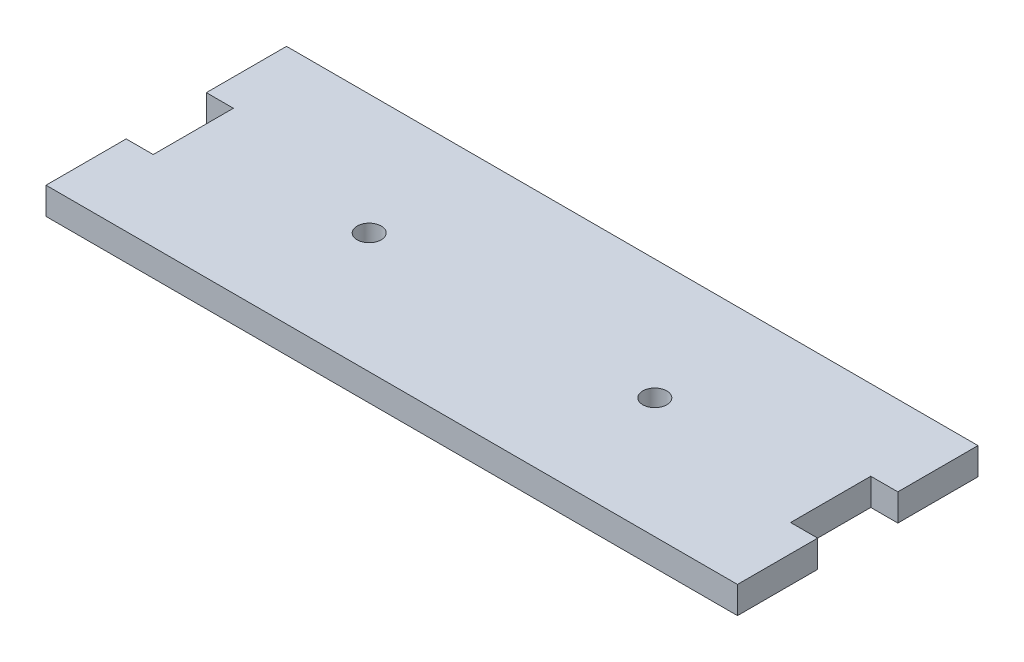
ISO-10303-21;
HEADER;
FILE_DESCRIPTION(('STEP AP214'),'2;1');
FILE_NAME('part.step','',(''),(''),'','','');
FILE_SCHEMA(('AUTOMOTIVE_DESIGN { 1 0 10303 214 1 1 1 1 }'));
ENDSEC;
DATA;
#1=APPLICATION_CONTEXT('core data for automotive mechanical design processes');
#2=APPLICATION_PROTOCOL_DEFINITION('international standard','automotive_design',2000,#1);
#3=PRODUCT_CONTEXT('',#1,'mechanical');
#4=PRODUCT('Part','Part','',(#3));
#5=PRODUCT_RELATED_PRODUCT_CATEGORY('part','',(#4));
#6=PRODUCT_DEFINITION_FORMATION('','',#4);
#7=PRODUCT_DEFINITION_CONTEXT('part definition',#1,'design');
#8=PRODUCT_DEFINITION('design','',#6,#7);
#9=PRODUCT_DEFINITION_SHAPE('','',#8);
#10=(LENGTH_UNIT() NAMED_UNIT(*) SI_UNIT(.MILLI.,.METRE.));
#11=(NAMED_UNIT(*) PLANE_ANGLE_UNIT() SI_UNIT($,.RADIAN.));
#12=(NAMED_UNIT(*) SI_UNIT($,.STERADIAN.) SOLID_ANGLE_UNIT());
#13=UNCERTAINTY_MEASURE_WITH_UNIT(LENGTH_MEASURE(1.E-05),#10,'distance_accuracy_value','');
#14=(GEOMETRIC_REPRESENTATION_CONTEXT(3) GLOBAL_UNCERTAINTY_ASSIGNED_CONTEXT((#13)) GLOBAL_UNIT_ASSIGNED_CONTEXT((#10,
#11,#12)) REPRESENTATION_CONTEXT('',''));
#15=CARTESIAN_POINT('',(0.,0.,0.));
#16=DIRECTION('',(0.,0.,1.));
#17=DIRECTION('',(1.,0.,0.));
#18=AXIS2_PLACEMENT_3D('',#15,#16,#17);
#19=CARTESIAN_POINT('',(221.,9.,0.));
#20=DIRECTION('',(1.,0.,0.));
#21=DIRECTION('',(0.,0.,-1.));
#22=AXIS2_PLACEMENT_3D('',#19,#20,#21);
#23=PLANE('',#22);
#24=DIRECTION('',(0.,0.,1.));
#25=VECTOR('',#24,1.);
#26=CARTESIAN_POINT('',(221.,0.,0.));
#27=LINE('',#26,#25);
#28=CARTESIAN_POINT('',(221.,0.,-53.3333333333334));
#29=VERTEX_POINT('',#28);
#30=CARTESIAN_POINT('',(221.,0.,-26.6666666666666));
#31=VERTEX_POINT('',#30);
#32=EDGE_CURVE('E163',#29,#31,#27,.T.);
#33=ORIENTED_EDGE('',*,*,#32,.F.);
#34=DIRECTION('',(0.,-1.,0.));
#35=VECTOR('',#34,1.);
#36=CARTESIAN_POINT('',(221.,9.,-53.3333333333334));
#37=LINE('',#36,#35);
#38=CARTESIAN_POINT('',(221.,9.,-53.3333333333334));
#39=VERTEX_POINT('',#38);
#40=EDGE_CURVE('E11',#39,#29,#37,.T.);
#41=ORIENTED_EDGE('',*,*,#40,.F.);
#42=DIRECTION('',(0.,0.,1.));
#43=VECTOR('',#42,1.);
#44=CARTESIAN_POINT('',(221.,9.,0.));
#45=LINE('',#44,#43);
#46=CARTESIAN_POINT('',(221.,9.,-26.6666666666666));
#47=VERTEX_POINT('',#46);
#48=EDGE_CURVE('E199',#39,#47,#45,.T.);
#49=ORIENTED_EDGE('',*,*,#48,.T.);
#50=DIRECTION('',(0.,-1.,0.));
#51=VECTOR('',#50,1.);
#52=CARTESIAN_POINT('',(221.,9.,-26.6666666666666));
#53=LINE('',#52,#51);
#54=EDGE_CURVE('E103',#47,#31,#53,.T.);
#55=ORIENTED_EDGE('',*,*,#54,.T.);
#56=EDGE_LOOP('',(#33,#41,#49,#55));
#57=FACE_BOUND('',#56,.T.);
#58=ADVANCED_FACE('F40',(#57),#23,.T.);
#59=CARTESIAN_POINT('',(3.28954970259314E-13,9.,-53.3333333333347));
#60=DIRECTION('',(0.,0.,1.));
#61=DIRECTION('',(1.,0.,0.));
#62=AXIS2_PLACEMENT_3D('',#59,#60,#61);
#63=PLANE('',#62);
#64=DIRECTION('',(-1.,0.,0.));
#65=VECTOR('',#64,1.);
#66=CARTESIAN_POINT('',(3.28954970259314E-13,0.,-53.3333333333347));
#67=LINE('',#66,#65);
#68=CARTESIAN_POINT('',(230.,0.,-53.3333333333333));
#69=VERTEX_POINT('',#68);
#70=EDGE_CURVE('E166',#69,#29,#67,.T.);
#71=ORIENTED_EDGE('',*,*,#70,.F.);
#72=DIRECTION('',(0.,-1.,0.));
#73=VECTOR('',#72,1.);
#74=CARTESIAN_POINT('',(230.,9.,-53.3333333333333));
#75=LINE('',#74,#73);
#76=CARTESIAN_POINT('',(230.,9.,-53.3333333333333));
#77=VERTEX_POINT('',#76);
#78=EDGE_CURVE('E48',#77,#69,#75,.T.);
#79=ORIENTED_EDGE('',*,*,#78,.F.);
#80=DIRECTION('',(-1.,0.,0.));
#81=VECTOR('',#80,1.);
#82=CARTESIAN_POINT('',(3.28954970259314E-13,9.,-53.3333333333347));
#83=LINE('',#82,#81);
#84=EDGE_CURVE('E230',#77,#39,#83,.T.);
#85=ORIENTED_EDGE('',*,*,#84,.T.);
#86=ORIENTED_EDGE('',*,*,#40,.T.);
#87=EDGE_LOOP('',(#71,#79,#85,#86));
#88=FACE_BOUND('',#87,.T.);
#89=ADVANCED_FACE('F229',(#88),#63,.T.);
#90=CARTESIAN_POINT('',(230.,9.,0.));
#91=DIRECTION('',(-1.,0.,0.));
#92=DIRECTION('',(0.,0.,1.));
#93=AXIS2_PLACEMENT_3D('',#90,#91,#92);
#94=PLANE('',#93);
#95=DIRECTION('',(0.,0.,-1.));
#96=VECTOR('',#95,1.);
#97=CARTESIAN_POINT('',(230.,0.,0.));
#98=LINE('',#97,#96);
#99=CARTESIAN_POINT('',(230.,0.,-80.));
#100=VERTEX_POINT('',#99);
#101=EDGE_CURVE('E169',#69,#100,#98,.T.);
#102=ORIENTED_EDGE('',*,*,#101,.T.);
#103=DIRECTION('',(0.,-1.,0.));
#104=VECTOR('',#103,1.);
#105=CARTESIAN_POINT('',(230.,9.,-80.));
#106=LINE('',#105,#104);
#107=CARTESIAN_POINT('',(230.,9.,-80.));
#108=VERTEX_POINT('',#107);
#109=EDGE_CURVE('E214',#108,#100,#106,.T.);
#110=ORIENTED_EDGE('',*,*,#109,.F.);
#111=DIRECTION('',(0.,0.,-1.));
#112=VECTOR('',#111,1.);
#113=CARTESIAN_POINT('',(230.,9.,0.));
#114=LINE('',#113,#112);
#115=EDGE_CURVE('E220',#77,#108,#114,.T.);
#116=ORIENTED_EDGE('',*,*,#115,.F.);
#117=ORIENTED_EDGE('',*,*,#78,.T.);
#118=EDGE_LOOP('',(#102,#110,#116,#117));
#119=FACE_BOUND('',#118,.T.);
#120=ADVANCED_FACE('F218',(#119),#94,.F.);
#121=CARTESIAN_POINT('',(0.,9.,-80.));
#122=DIRECTION('',(0.,0.,-1.));
#123=DIRECTION('',(-1.,0.,0.));
#124=AXIS2_PLACEMENT_3D('',#121,#122,#123);
#125=PLANE('',#124);
#126=DIRECTION('',(1.,0.,0.));
#127=VECTOR('',#126,1.);
#128=CARTESIAN_POINT('',(0.,0.,-80.));
#129=LINE('',#128,#127);
#130=CARTESIAN_POINT('',(0.,0.,-80.));
#131=VERTEX_POINT('',#130);
#132=EDGE_CURVE('E172',#131,#100,#129,.T.);
#133=ORIENTED_EDGE('',*,*,#132,.F.);
#134=DIRECTION('',(0.,-1.,0.));
#135=VECTOR('',#134,1.);
#136=CARTESIAN_POINT('',(0.,9.,-80.));
#137=LINE('',#136,#135);
#138=CARTESIAN_POINT('',(0.,9.,-80.));
#139=VERTEX_POINT('',#138);
#140=EDGE_CURVE('E212',#139,#131,#137,.T.);
#141=ORIENTED_EDGE('',*,*,#140,.F.);
#142=DIRECTION('',(1.,0.,0.));
#143=VECTOR('',#142,1.);
#144=CARTESIAN_POINT('',(0.,9.,-80.));
#145=LINE('',#144,#143);
#146=EDGE_CURVE('E238',#139,#108,#145,.T.);
#147=ORIENTED_EDGE('',*,*,#146,.T.);
#148=ORIENTED_EDGE('',*,*,#109,.T.);
#149=EDGE_LOOP('',(#133,#141,#147,#148));
#150=FACE_BOUND('',#149,.T.);
#151=ADVANCED_FACE('F272',(#150),#125,.T.);
#152=CARTESIAN_POINT('',(0.,9.,0.));
#153=DIRECTION('',(-1.,0.,0.));
#154=DIRECTION('',(0.,0.,1.));
#155=AXIS2_PLACEMENT_3D('',#152,#153,#154);
#156=PLANE('',#155);
#157=DIRECTION('',(0.,0.,-1.));
#158=VECTOR('',#157,1.);
#159=CARTESIAN_POINT('',(0.,0.,0.));
#160=LINE('',#159,#158);
#161=CARTESIAN_POINT('',(0.,0.,-53.3333333333333));
#162=VERTEX_POINT('',#161);
#163=EDGE_CURVE('E175',#162,#131,#160,.T.);
#164=ORIENTED_EDGE('',*,*,#163,.F.);
#165=DIRECTION('',(0.,-1.,0.));
#166=VECTOR('',#165,1.);
#167=CARTESIAN_POINT('',(0.,9.,-53.3333333333333));
#168=LINE('',#167,#166);
#169=CARTESIAN_POINT('',(0.,9.,-53.3333333333333));
#170=VERTEX_POINT('',#169);
#171=EDGE_CURVE('E210',#170,#162,#168,.T.);
#172=ORIENTED_EDGE('',*,*,#171,.F.);
#173=DIRECTION('',(0.,0.,-1.));
#174=VECTOR('',#173,1.);
#175=CARTESIAN_POINT('',(0.,9.,0.));
#176=LINE('',#175,#174);
#177=EDGE_CURVE('E241',#170,#139,#176,.T.);
#178=ORIENTED_EDGE('',*,*,#177,.T.);
#179=ORIENTED_EDGE('',*,*,#140,.T.);
#180=EDGE_LOOP('',(#164,#172,#178,#179));
#181=FACE_BOUND('',#180,.T.);
#182=ADVANCED_FACE('F269',(#181),#156,.T.);
#183=CARTESIAN_POINT('',(0.,9.,-53.3333333333333));
#184=DIRECTION('',(0.,0.,-1.));
#185=DIRECTION('',(-1.,0.,0.));
#186=AXIS2_PLACEMENT_3D('',#183,#184,#185);
#187=PLANE('',#186);
#188=DIRECTION('',(1.,0.,0.));
#189=VECTOR('',#188,1.);
#190=CARTESIAN_POINT('',(0.,0.,-53.3333333333333));
#191=LINE('',#190,#189);
#192=CARTESIAN_POINT('',(9.00000000000001,0.,-53.3333333333333));
#193=VERTEX_POINT('',#192);
#194=EDGE_CURVE('E178',#162,#193,#191,.T.);
#195=ORIENTED_EDGE('',*,*,#194,.T.);
#196=DIRECTION('',(0.,-1.,0.));
#197=VECTOR('',#196,1.);
#198=CARTESIAN_POINT('',(9.00000000000001,9.,-53.3333333333333));
#199=LINE('',#198,#197);
#200=CARTESIAN_POINT('',(9.00000000000001,9.,-53.3333333333333));
#201=VERTEX_POINT('',#200);
#202=EDGE_CURVE('E207',#201,#193,#199,.T.);
#203=ORIENTED_EDGE('',*,*,#202,.F.);
#204=DIRECTION('',(1.,0.,0.));
#205=VECTOR('',#204,1.);
#206=CARTESIAN_POINT('',(0.,9.,-53.3333333333333));
#207=LINE('',#206,#205);
#208=EDGE_CURVE('E244',#170,#201,#207,.T.);
#209=ORIENTED_EDGE('',*,*,#208,.F.);
#210=ORIENTED_EDGE('',*,*,#171,.T.);
#211=EDGE_LOOP('',(#195,#203,#209,#210));
#212=FACE_BOUND('',#211,.T.);
#213=ADVANCED_FACE('F265',(#212),#187,.F.);
#214=CARTESIAN_POINT('',(9.00000000000001,9.,0.));
#215=DIRECTION('',(1.,0.,0.));
#216=DIRECTION('',(0.,0.,-1.));
#217=AXIS2_PLACEMENT_3D('',#214,#215,#216);
#218=PLANE('',#217);
#219=DIRECTION('',(0.,0.,1.));
#220=VECTOR('',#219,1.);
#221=CARTESIAN_POINT('',(9.00000000000001,0.,0.));
#222=LINE('',#221,#220);
#223=CARTESIAN_POINT('',(9.00000000000001,0.,-26.6666666666667));
#224=VERTEX_POINT('',#223);
#225=EDGE_CURVE('E180',#193,#224,#222,.T.);
#226=ORIENTED_EDGE('',*,*,#225,.T.);
#227=DIRECTION('',(0.,-1.,0.));
#228=VECTOR('',#227,1.);
#229=CARTESIAN_POINT('',(9.00000000000001,9.,-26.6666666666667));
#230=LINE('',#229,#228);
#231=CARTESIAN_POINT('',(9.00000000000001,9.,-26.6666666666667));
#232=VERTEX_POINT('',#231);
#233=EDGE_CURVE('E205',#232,#224,#230,.T.);
#234=ORIENTED_EDGE('',*,*,#233,.F.);
#235=DIRECTION('',(0.,0.,1.));
#236=VECTOR('',#235,1.);
#237=CARTESIAN_POINT('',(9.00000000000001,9.,0.));
#238=LINE('',#237,#236);
#239=EDGE_CURVE('E246',#201,#232,#238,.T.);
#240=ORIENTED_EDGE('',*,*,#239,.F.);
#241=ORIENTED_EDGE('',*,*,#202,.T.);
#242=EDGE_LOOP('',(#226,#234,#240,#241));
#243=FACE_BOUND('',#242,.T.);
#244=ADVANCED_FACE('F261',(#243),#218,.F.);
#245=CARTESIAN_POINT('',(0.,9.,-26.6666666666667));
#246=DIRECTION('',(0.,0.,-1.));
#247=DIRECTION('',(-1.,0.,0.));
#248=AXIS2_PLACEMENT_3D('',#245,#246,#247);
#249=PLANE('',#248);
#250=DIRECTION('',(1.,0.,0.));
#251=VECTOR('',#250,1.);
#252=CARTESIAN_POINT('',(0.,0.,-26.6666666666667));
#253=LINE('',#252,#251);
#254=CARTESIAN_POINT('',(0.,0.,-26.6666666666667));
#255=VERTEX_POINT('',#254);
#256=EDGE_CURVE('E183',#255,#224,#253,.T.);
#257=ORIENTED_EDGE('',*,*,#256,.F.);
#258=DIRECTION('',(0.,-1.,0.));
#259=VECTOR('',#258,1.);
#260=CARTESIAN_POINT('',(0.,9.,-26.6666666666667));
#261=LINE('',#260,#259);
#262=CARTESIAN_POINT('',(0.,9.,-26.6666666666667));
#263=VERTEX_POINT('',#262);
#264=EDGE_CURVE('E203',#263,#255,#261,.T.);
#265=ORIENTED_EDGE('',*,*,#264,.F.);
#266=DIRECTION('',(1.,0.,0.));
#267=VECTOR('',#266,1.);
#268=CARTESIAN_POINT('',(0.,9.,-26.6666666666667));
#269=LINE('',#268,#267);
#270=EDGE_CURVE('E248',#263,#232,#269,.T.);
#271=ORIENTED_EDGE('',*,*,#270,.T.);
#272=ORIENTED_EDGE('',*,*,#233,.T.);
#273=EDGE_LOOP('',(#257,#265,#271,#272));
#274=FACE_BOUND('',#273,.T.);
#275=ADVANCED_FACE('F257',(#274),#249,.T.);
#276=CARTESIAN_POINT('',(0.,9.,0.));
#277=DIRECTION('',(-1.,0.,0.));
#278=DIRECTION('',(0.,0.,1.));
#279=AXIS2_PLACEMENT_3D('',#276,#277,#278);
#280=PLANE('',#279);
#281=DIRECTION('',(0.,0.,-1.));
#282=VECTOR('',#281,1.);
#283=CARTESIAN_POINT('',(0.,0.,0.));
#284=LINE('',#283,#282);
#285=CARTESIAN_POINT('',(0.,0.,0.));
#286=VERTEX_POINT('',#285);
#287=EDGE_CURVE('E186',#286,#255,#284,.T.);
#288=ORIENTED_EDGE('',*,*,#287,.F.);
#289=DIRECTION('',(0.,-1.,0.));
#290=VECTOR('',#289,1.);
#291=CARTESIAN_POINT('',(0.,9.,0.));
#292=LINE('',#291,#290);
#293=CARTESIAN_POINT('',(0.,9.,0.));
#294=VERTEX_POINT('',#293);
#295=EDGE_CURVE('E149',#294,#286,#292,.T.);
#296=ORIENTED_EDGE('',*,*,#295,.F.);
#297=DIRECTION('',(0.,0.,-1.));
#298=VECTOR('',#297,1.);
#299=CARTESIAN_POINT('',(0.,9.,0.));
#300=LINE('',#299,#298);
#301=EDGE_CURVE('E142',#294,#263,#300,.T.);
#302=ORIENTED_EDGE('',*,*,#301,.T.);
#303=ORIENTED_EDGE('',*,*,#264,.T.);
#304=EDGE_LOOP('',(#288,#296,#302,#303));
#305=FACE_BOUND('',#304,.T.);
#306=ADVANCED_FACE('F252',(#305),#280,.T.);
#307=CARTESIAN_POINT('',(0.,9.,0.));
#308=DIRECTION('',(0.,0.,-1.));
#309=DIRECTION('',(-1.,0.,0.));
#310=AXIS2_PLACEMENT_3D('',#307,#308,#309);
#311=PLANE('',#310);
#312=DIRECTION('',(1.,0.,0.));
#313=VECTOR('',#312,1.);
#314=CARTESIAN_POINT('',(0.,0.,0.));
#315=LINE('',#314,#313);
#316=CARTESIAN_POINT('',(230.,0.,0.));
#317=VERTEX_POINT('',#316);
#318=EDGE_CURVE('E148',#286,#317,#315,.T.);
#319=ORIENTED_EDGE('',*,*,#318,.T.);
#320=DIRECTION('',(0.,-1.,0.));
#321=VECTOR('',#320,1.);
#322=CARTESIAN_POINT('',(230.,9.,0.));
#323=LINE('',#322,#321);
#324=CARTESIAN_POINT('',(230.,9.,0.));
#325=VERTEX_POINT('',#324);
#326=EDGE_CURVE('E145',#325,#317,#323,.T.);
#327=ORIENTED_EDGE('',*,*,#326,.F.);
#328=DIRECTION('',(1.,0.,0.));
#329=VECTOR('',#328,1.);
#330=CARTESIAN_POINT('',(0.,9.,0.));
#331=LINE('',#330,#329);
#332=EDGE_CURVE('E134',#294,#325,#331,.T.);
#333=ORIENTED_EDGE('',*,*,#332,.F.);
#334=ORIENTED_EDGE('',*,*,#295,.T.);
#335=EDGE_LOOP('',(#319,#327,#333,#334));
#336=FACE_BOUND('',#335,.T.);
#337=ADVANCED_FACE('F146',(#336),#311,.F.);
#338=CARTESIAN_POINT('',(230.,9.,0.));
#339=DIRECTION('',(-1.,0.,0.));
#340=DIRECTION('',(0.,0.,1.));
#341=AXIS2_PLACEMENT_3D('',#338,#339,#340);
#342=PLANE('',#341);
#343=DIRECTION('',(0.,0.,-1.));
#344=VECTOR('',#343,1.);
#345=CARTESIAN_POINT('',(230.,0.,0.));
#346=LINE('',#345,#344);
#347=CARTESIAN_POINT('',(230.,0.,-26.6666666666667));
#348=VERTEX_POINT('',#347);
#349=EDGE_CURVE('E96',#317,#348,#346,.T.);
#350=ORIENTED_EDGE('',*,*,#349,.T.);
#351=DIRECTION('',(0.,-1.,0.));
#352=VECTOR('',#351,1.);
#353=CARTESIAN_POINT('',(230.,9.,-26.6666666666667));
#354=LINE('',#353,#352);
#355=CARTESIAN_POINT('',(230.,9.,-26.6666666666667));
#356=VERTEX_POINT('',#355);
#357=EDGE_CURVE('E150',#356,#348,#354,.T.);
#358=ORIENTED_EDGE('',*,*,#357,.F.);
#359=DIRECTION('',(0.,0.,-1.));
#360=VECTOR('',#359,1.);
#361=CARTESIAN_POINT('',(230.,9.,0.));
#362=LINE('',#361,#360);
#363=EDGE_CURVE('E139',#325,#356,#362,.T.);
#364=ORIENTED_EDGE('',*,*,#363,.F.);
#365=ORIENTED_EDGE('',*,*,#326,.T.);
#366=EDGE_LOOP('',(#350,#358,#364,#365));
#367=FACE_BOUND('',#366,.T.);
#368=ADVANCED_FACE('F152',(#367),#342,.F.);
#369=CARTESIAN_POINT('',(67.5,9.,-40.));
#370=DIRECTION('',(0.,-1.,0.));
#371=DIRECTION('',(0.,0.,-1.));
#372=AXIS2_PLACEMENT_3D('',#369,#370,#371);
#373=CYLINDRICAL_SURFACE('',#372,4.00000000000001);
#374=CARTESIAN_POINT('',(67.5,9.,-40.));
#375=DIRECTION('',(0.,1.,0.));
#376=DIRECTION('',(0.,0.,1.));
#377=AXIS2_PLACEMENT_3D('',#374,#375,#376);
#378=CIRCLE('',#377,4.00000000000001);
#379=CARTESIAN_POINT('',(67.5,9.,-36.));
#380=VERTEX_POINT('',#379);
#381=EDGE_CURVE('E154',#380,#380,#378,.T.);
#382=ORIENTED_EDGE('',*,*,#381,.T.);
#383=EDGE_LOOP('',(#382));
#384=FACE_BOUND('',#383,.T.);
#385=CARTESIAN_POINT('',(67.5,0.,-40.));
#386=DIRECTION('',(0.,1.,0.));
#387=DIRECTION('',(0.,0.,1.));
#388=AXIS2_PLACEMENT_3D('',#385,#386,#387);
#389=CIRCLE('',#388,4.00000000000001);
#390=CARTESIAN_POINT('',(67.5,0.,-36.));
#391=VERTEX_POINT('',#390);
#392=EDGE_CURVE('E193',#391,#391,#389,.T.);
#393=ORIENTED_EDGE('',*,*,#392,.F.);
#394=EDGE_LOOP('',(#393));
#395=FACE_BOUND('',#394,.T.);
#396=ADVANCED_FACE('F359',(#384,#395),#373,.F.);
#397=CARTESIAN_POINT('',(-1.64477485129644E-13,9.,-26.6666666666653));
#398=DIRECTION('',(0.,0.,1.));
#399=DIRECTION('',(1.,0.,0.));
#400=AXIS2_PLACEMENT_3D('',#397,#398,#399);
#401=PLANE('',#400);
#402=DIRECTION('',(-1.,0.,0.));
#403=VECTOR('',#402,1.);
#404=CARTESIAN_POINT('',(-1.64477485129644E-13,0.,-26.6666666666653));
#405=LINE('',#404,#403);
#406=EDGE_CURVE('E191',#348,#31,#405,.T.);
#407=ORIENTED_EDGE('',*,*,#406,.T.);
#408=ORIENTED_EDGE('',*,*,#54,.F.);
#409=DIRECTION('',(-1.,0.,0.));
#410=VECTOR('',#409,1.);
#411=CARTESIAN_POINT('',(-1.64477485129644E-13,9.,-26.6666666666653));
#412=LINE('',#411,#410);
#413=EDGE_CURVE('E56',#356,#47,#412,.T.);
#414=ORIENTED_EDGE('',*,*,#413,.F.);
#415=ORIENTED_EDGE('',*,*,#357,.T.);
#416=EDGE_LOOP('',(#407,#408,#414,#415));
#417=FACE_BOUND('',#416,.T.);
#418=ADVANCED_FACE('F233',(#417),#401,.F.);
#419=CARTESIAN_POINT('',(162.5,9.,-40.));
#420=DIRECTION('',(0.,-1.,0.));
#421=DIRECTION('',(0.,0.,-1.));
#422=AXIS2_PLACEMENT_3D('',#419,#420,#421);
#423=CYLINDRICAL_SURFACE('',#422,4.00000000000002);
#424=CARTESIAN_POINT('',(162.5,9.,-40.));
#425=DIRECTION('',(0.,1.,0.));
#426=DIRECTION('',(0.,0.,1.));
#427=AXIS2_PLACEMENT_3D('',#424,#425,#426);
#428=CIRCLE('',#427,4.00000000000002);
#429=CARTESIAN_POINT('',(162.5,9.,-36.));
#430=VERTEX_POINT('',#429);
#431=EDGE_CURVE('E160',#430,#430,#428,.F.);
#432=ORIENTED_EDGE('',*,*,#431,.F.);
#433=EDGE_LOOP('',(#432));
#434=FACE_BOUND('',#433,.T.);
#435=CARTESIAN_POINT('',(162.5,0.,-40.));
#436=DIRECTION('',(0.,1.,0.));
#437=DIRECTION('',(0.,0.,1.));
#438=AXIS2_PLACEMENT_3D('',#435,#436,#437);
#439=CIRCLE('',#438,4.00000000000002);
#440=CARTESIAN_POINT('',(162.5,0.,-36.));
#441=VERTEX_POINT('',#440);
#442=EDGE_CURVE('E196',#441,#441,#439,.F.);
#443=ORIENTED_EDGE('',*,*,#442,.T.);
#444=EDGE_LOOP('',(#443));
#445=FACE_BOUND('',#444,.T.);
#446=ADVANCED_FACE('F378',(#434,#445),#423,.F.);
#447=CARTESIAN_POINT('',(0.,9.,0.));
#448=DIRECTION('',(0.,1.,0.));
#449=DIRECTION('',(0.,0.,1.));
#450=AXIS2_PLACEMENT_3D('',#447,#448,#449);
#451=PLANE('',#450);
#452=ORIENTED_EDGE('',*,*,#48,.F.);
#453=ORIENTED_EDGE('',*,*,#84,.F.);
#454=ORIENTED_EDGE('',*,*,#115,.T.);
#455=ORIENTED_EDGE('',*,*,#146,.F.);
#456=ORIENTED_EDGE('',*,*,#177,.F.);
#457=ORIENTED_EDGE('',*,*,#208,.T.);
#458=ORIENTED_EDGE('',*,*,#239,.T.);
#459=ORIENTED_EDGE('',*,*,#270,.F.);
#460=ORIENTED_EDGE('',*,*,#301,.F.);
#461=ORIENTED_EDGE('',*,*,#332,.T.);
#462=ORIENTED_EDGE('',*,*,#363,.T.);
#463=ORIENTED_EDGE('',*,*,#413,.T.);
#464=EDGE_LOOP('',(#452,#453,#454,#455,#456,#457,#458,#459,#460,#461,#462,#463));
#465=FACE_BOUND('',#464,.T.);
#466=ORIENTED_EDGE('',*,*,#381,.F.);
#467=EDGE_LOOP('',(#466));
#468=FACE_BOUND('',#467,.T.);
#469=ORIENTED_EDGE('',*,*,#431,.T.);
#470=EDGE_LOOP('',(#469));
#471=FACE_BOUND('',#470,.T.);
#472=ADVANCED_FACE('F136',(#465,#468,#471),#451,.T.);
#473=CARTESIAN_POINT('',(0.,0.,0.));
#474=DIRECTION('',(0.,1.,0.));
#475=DIRECTION('',(0.,0.,1.));
#476=AXIS2_PLACEMENT_3D('',#473,#474,#475);
#477=PLANE('',#476);
#478=ORIENTED_EDGE('',*,*,#32,.T.);
#479=ORIENTED_EDGE('',*,*,#406,.F.);
#480=ORIENTED_EDGE('',*,*,#349,.F.);
#481=ORIENTED_EDGE('',*,*,#318,.F.);
#482=ORIENTED_EDGE('',*,*,#287,.T.);
#483=ORIENTED_EDGE('',*,*,#256,.T.);
#484=ORIENTED_EDGE('',*,*,#225,.F.);
#485=ORIENTED_EDGE('',*,*,#194,.F.);
#486=ORIENTED_EDGE('',*,*,#163,.T.);
#487=ORIENTED_EDGE('',*,*,#132,.T.);
#488=ORIENTED_EDGE('',*,*,#101,.F.);
#489=ORIENTED_EDGE('',*,*,#70,.T.);
#490=EDGE_LOOP('',(#478,#479,#480,#481,#482,#483,#484,#485,#486,#487,#488,#489));
#491=FACE_BOUND('',#490,.T.);
#492=ORIENTED_EDGE('',*,*,#392,.T.);
#493=EDGE_LOOP('',(#492));
#494=FACE_BOUND('',#493,.T.);
#495=ORIENTED_EDGE('',*,*,#442,.F.);
#496=EDGE_LOOP('',(#495));
#497=FACE_BOUND('',#496,.T.);
#498=ADVANCED_FACE('F226',(#491,#494,#497),#477,.F.);
#499=CLOSED_SHELL('',(#58,#89,#120,#151,#182,#213,#244,#275,#306,#337,#368,#396,#418,#446,#472,#498));
#500=MANIFOLD_SOLID_BREP('B2',#499);
#501=ADVANCED_BREP_SHAPE_REPRESENTATION('',(#18,#500),#14);
#502=SHAPE_DEFINITION_REPRESENTATION(#9,#501);
ENDSEC;
END-ISO-10303-21;
